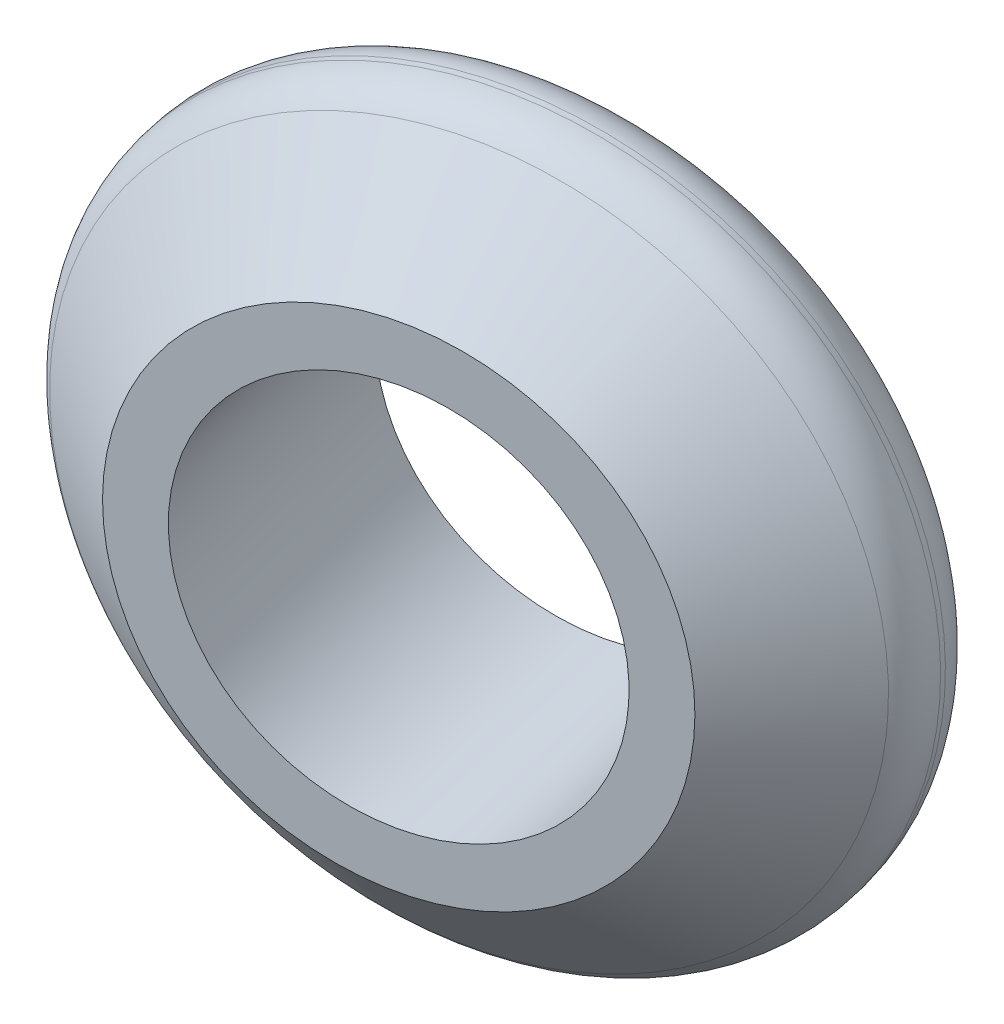
ISO-10303-21;
HEADER;
FILE_DESCRIPTION(('STEP AP214'),'2;1');
FILE_NAME('part.step','',(''),(''),'','','');
FILE_SCHEMA(('AUTOMOTIVE_DESIGN { 1 0 10303 214 1 1 1 1 }'));
ENDSEC;
DATA;
#1=APPLICATION_CONTEXT('core data for automotive mechanical design processes');
#2=APPLICATION_PROTOCOL_DEFINITION('international standard','automotive_design',2000,#1);
#3=PRODUCT_CONTEXT('',#1,'mechanical');
#4=PRODUCT('Part','Part','',(#3));
#5=PRODUCT_RELATED_PRODUCT_CATEGORY('part','',(#4));
#6=PRODUCT_DEFINITION_FORMATION('','',#4);
#7=PRODUCT_DEFINITION_CONTEXT('part definition',#1,'design');
#8=PRODUCT_DEFINITION('design','',#6,#7);
#9=PRODUCT_DEFINITION_SHAPE('','',#8);
#10=(LENGTH_UNIT() NAMED_UNIT(*) SI_UNIT(.MILLI.,.METRE.));
#11=(NAMED_UNIT(*) PLANE_ANGLE_UNIT() SI_UNIT($,.RADIAN.));
#12=(NAMED_UNIT(*) SI_UNIT($,.STERADIAN.) SOLID_ANGLE_UNIT());
#13=UNCERTAINTY_MEASURE_WITH_UNIT(LENGTH_MEASURE(1.E-05),#10,'distance_accuracy_value','');
#14=(GEOMETRIC_REPRESENTATION_CONTEXT(3) GLOBAL_UNCERTAINTY_ASSIGNED_CONTEXT((#13)) GLOBAL_UNIT_ASSIGNED_CONTEXT((#10,
#11,#12)) REPRESENTATION_CONTEXT('',''));
#15=CARTESIAN_POINT('',(0.,0.,0.));
#16=DIRECTION('',(0.,0.,1.));
#17=DIRECTION('',(1.,0.,0.));
#18=AXIS2_PLACEMENT_3D('',#15,#16,#17);
#19=CARTESIAN_POINT('',(-50.,-52.,-19.));
#20=DIRECTION('',(-0.223025134186867,0.,-0.97481269458339));
#21=DIRECTION('',(-0.435945374373544,0.894429302013567,0.0997389305228074));
#22=AXIS2_PLACEMENT_3D('',#19,#20,#21);
#23=CYLINDRICAL_SURFACE('',#22,7.);
#24=CARTESIAN_POINT('',(-48.8848743290657,-52.,-14.125936527083));
#25=DIRECTION('',(-0.223025134186867,0.,-0.97481269458339));
#26=DIRECTION('',(-0.435945374373544,0.894429302013567,0.0997389305228074));
#27=AXIS2_PLACEMENT_3D('',#24,#25,#26);
#28=CIRCLE('',#27,7.);
#29=CARTESIAN_POINT('',(-51.9364919496805,-45.738994885905,-13.4277640134234));
#30=VERTEX_POINT('',#29);
#31=EDGE_CURVE('E59',#30,#30,#28,.T.);
#32=ORIENTED_EDGE('',*,*,#31,.F.);
#33=EDGE_LOOP('',(#32));
#34=FACE_BOUND('',#33,.T.);
#35=CARTESIAN_POINT('',(-51.1151256709343,-52.,-23.8740634729169));
#36=DIRECTION('',(-0.223025134186867,0.,-0.97481269458339));
#37=DIRECTION('',(-0.435945374373544,0.894429302013567,0.0997389305228074));
#38=AXIS2_PLACEMENT_3D('',#35,#36,#37);
#39=CIRCLE('',#38,7.);
#40=CARTESIAN_POINT('',(-54.1667432915491,-45.738994885905,-23.1758909592573));
#41=VERTEX_POINT('',#40);
#42=EDGE_CURVE('E65',#41,#41,#39,.T.);
#43=ORIENTED_EDGE('',*,*,#42,.T.);
#44=EDGE_LOOP('',(#43));
#45=FACE_BOUND('',#44,.T.);
#46=ADVANCED_FACE('F36',(#34,#45),#23,.F.);
#47=CARTESIAN_POINT('',(-50.,-52.,-19.));
#48=DIRECTION('',(-0.223025134186867,0.,-0.97481269458339));
#49=DIRECTION('',(-0.435945374373544,0.894429302013567,0.0997389305228074));
#50=AXIS2_PLACEMENT_3D('',#47,#48,#49);
#51=CYLINDRICAL_SURFACE('',#50,13.4);
#52=CARTESIAN_POINT('',(-49.9742940722374,-52.,-18.8876428667987));
#53=DIRECTION('',(0.223025134186867,0.,0.97481269458339));
#54=DIRECTION('',(0.435945374373544,-0.894429302013567,-0.0997389305228074));
#55=AXIS2_PLACEMENT_3D('',#52,#53,#54);
#56=CIRCLE('',#55,13.4);
#57=CARTESIAN_POINT('',(-44.1326260556319,-63.9853526469818,-20.2241445358043));
#58=VERTEX_POINT('',#57);
#59=EDGE_CURVE('E47',#58,#58,#56,.F.);
#60=ORIENTED_EDGE('',*,*,#59,.T.);
#61=EDGE_LOOP('',(#60));
#62=FACE_BOUND('',#61,.T.);
#63=CARTESIAN_POINT('',(-50.0257059277627,-52.,-19.1123571332013));
#64=DIRECTION('',(0.223025134186867,0.,0.97481269458339));
#65=DIRECTION('',(0.435945374373544,-0.894429302013567,-0.0997389305228074));
#66=AXIS2_PLACEMENT_3D('',#63,#64,#65);
#67=CIRCLE('',#66,13.4);
#68=CARTESIAN_POINT('',(-44.1840379111572,-63.9853526469818,-20.4488588022069));
#69=VERTEX_POINT('',#68);
#70=EDGE_CURVE('E51',#69,#69,#67,.T.);
#71=ORIENTED_EDGE('',*,*,#70,.T.);
#72=EDGE_LOOP('',(#71));
#73=FACE_BOUND('',#72,.T.);
#74=ADVANCED_FACE('F88',(#62,#73),#51,.T.);
#75=CARTESIAN_POINT('',(-48.8848743290657,-52.,-14.1259365270831));
#76=DIRECTION('',(-0.223025134186867,0.,-0.97481269458339));
#77=DIRECTION('',(-0.435945374373544,0.894429302013567,0.0997389305228074));
#78=AXIS2_PLACEMENT_3D('',#75,#76,#77);
#79=CONICAL_SURFACE('',#78,9.,0.832981266674432);
#80=CARTESIAN_POINT('',(-49.6442436039186,-52.,-17.4450369132441));
#81=DIRECTION('',(0.223025134186867,0.,0.97481269458339));
#82=DIRECTION('',(0.435945374373544,-0.894429302013567,-0.0997389305228074));
#83=AXIS2_PLACEMENT_3D('',#80,#81,#82);
#84=CIRCLE('',#83,12.7453455879926);
#85=CARTESIAN_POINT('',(-44.087969150041,-63.39981055819,-18.716244051334));
#86=VERTEX_POINT('',#85);
#87=EDGE_CURVE('E43',#86,#86,#84,.T.);
#88=ORIENTED_EDGE('',*,*,#87,.T.);
#89=EDGE_LOOP('',(#88));
#90=FACE_BOUND('',#89,.T.);
#91=CARTESIAN_POINT('',(-48.8848743290657,-52.,-14.1259365270831));
#92=DIRECTION('',(-0.223025134186867,0.,-0.97481269458339));
#93=DIRECTION('',(-0.435945374373544,0.894429302013567,0.0997389305228074));
#94=AXIS2_PLACEMENT_3D('',#91,#92,#93);
#95=CIRCLE('',#94,9.);
#96=CARTESIAN_POINT('',(-52.8083826984276,-43.9501362818779,-13.2282861523778));
#97=VERTEX_POINT('',#96);
#98=EDGE_CURVE('E56',#97,#97,#95,.T.);
#99=ORIENTED_EDGE('',*,*,#98,.T.);
#100=EDGE_LOOP('',(#99));
#101=FACE_BOUND('',#100,.T.);
#102=ADVANCED_FACE('F84',(#90,#101),#79,.T.);
#103=CARTESIAN_POINT('',(-48.8848743290657,-52.,-14.125936527083));
#104=DIRECTION('',(0.223025134186867,0.,0.97481269458339));
#105=DIRECTION('',(0.435945374373544,-0.894429302013567,-0.0997389305228074));
#106=AXIS2_PLACEMENT_3D('',#103,#104,#105);
#107=PLANE('',#106);
#108=ORIENTED_EDGE('',*,*,#31,.T.);
#109=EDGE_LOOP('',(#108));
#110=FACE_BOUND('',#109,.T.);
#111=ORIENTED_EDGE('',*,*,#98,.F.);
#112=EDGE_LOOP('',(#111));
#113=FACE_BOUND('',#112,.T.);
#114=ADVANCED_FACE('F79',(#110,#113),#107,.T.);
#115=CARTESIAN_POINT('',(-51.1151256709343,-52.,-23.8740634729169));
#116=DIRECTION('',(0.223025134186867,0.,0.97481269458339));
#117=DIRECTION('',(-0.435945374373544,0.894429302013567,0.0997389305228074));
#118=AXIS2_PLACEMENT_3D('',#115,#116,#117);
#119=CONICAL_SURFACE('',#118,9.,0.832981266674432);
#120=CARTESIAN_POINT('',(-50.3557563960814,-52.,-20.5549630867559));
#121=DIRECTION('',(-0.223025134186867,0.,-0.97481269458339));
#122=DIRECTION('',(-0.435945374373544,0.894429302013567,0.0997389305228074));
#123=AXIS2_PLACEMENT_3D('',#120,#121,#122);
#124=CIRCLE('',#123,12.7453455879926);
#125=CARTESIAN_POINT('',(-55.912030849959,-40.6001894418101,-19.283755948666));
#126=VERTEX_POINT('',#125);
#127=EDGE_CURVE('E10',#126,#126,#124,.T.);
#128=ORIENTED_EDGE('',*,*,#127,.T.);
#129=EDGE_LOOP('',(#128));
#130=FACE_BOUND('',#129,.T.);
#131=CARTESIAN_POINT('',(-51.1151256709343,-52.,-23.8740634729169));
#132=DIRECTION('',(-0.223025134186867,0.,-0.97481269458339));
#133=DIRECTION('',(-0.435945374373544,0.894429302013567,0.0997389305228074));
#134=AXIS2_PLACEMENT_3D('',#131,#132,#133);
#135=CIRCLE('',#134,9.);
#136=CARTESIAN_POINT('',(-55.0386340402962,-43.9501362818779,-22.9764130982117));
#137=VERTEX_POINT('',#136);
#138=EDGE_CURVE('E62',#137,#137,#135,.T.);
#139=ORIENTED_EDGE('',*,*,#138,.F.);
#140=EDGE_LOOP('',(#139));
#141=FACE_BOUND('',#140,.T.);
#142=ADVANCED_FACE('F74',(#130,#141),#119,.T.);
#143=CARTESIAN_POINT('',(-51.1151256709343,-52.,-23.8740634729169));
#144=DIRECTION('',(-0.223025134186867,0.,-0.97481269458339));
#145=DIRECTION('',(0.435945374373544,-0.894429302013567,-0.0997389305228074));
#146=AXIS2_PLACEMENT_3D('',#143,#144,#145);
#147=PLANE('',#146);
#148=ORIENTED_EDGE('',*,*,#42,.F.);
#149=EDGE_LOOP('',(#148));
#150=FACE_BOUND('',#149,.T.);
#151=ORIENTED_EDGE('',*,*,#138,.T.);
#152=EDGE_LOOP('',(#151));
#153=FACE_BOUND('',#152,.T.);
#154=ADVANCED_FACE('F70',(#150,#153),#147,.T.);
#155=CARTESIAN_POINT('',(-49.9742940722374,-52.,-18.8876428667987));
#156=DIRECTION('',(0.223025134186867,0.,0.97481269458339));
#157=DIRECTION('',(0.435945374373544,-0.894429302013567,-0.0997389305228074));
#158=AXIS2_PLACEMENT_3D('',#155,#156,#157);
#159=TOROIDAL_SURFACE('',#158,11.4,2.);
#160=ORIENTED_EDGE('',*,*,#87,.F.);
#161=EDGE_LOOP('',(#160));
#162=FACE_BOUND('',#161,.T.);
#163=ORIENTED_EDGE('',*,*,#59,.F.);
#164=EDGE_LOOP('',(#163));
#165=FACE_BOUND('',#164,.T.);
#166=ADVANCED_FACE('F73',(#162,#165),#159,.T.);
#167=CARTESIAN_POINT('',(-50.0257059277627,-52.,-19.1123571332013));
#168=DIRECTION('',(0.223025134186867,0.,0.97481269458339));
#169=DIRECTION('',(0.435945374373544,-0.894429302013567,-0.0997389305228074));
#170=AXIS2_PLACEMENT_3D('',#167,#168,#169);
#171=TOROIDAL_SURFACE('',#170,11.4,2.);
#172=ORIENTED_EDGE('',*,*,#70,.F.);
#173=EDGE_LOOP('',(#172));
#174=FACE_BOUND('',#173,.T.);
#175=ORIENTED_EDGE('',*,*,#127,.F.);
#176=EDGE_LOOP('',(#175));
#177=FACE_BOUND('',#176,.T.);
#178=ADVANCED_FACE('F38',(#174,#177),#171,.T.);
#179=CLOSED_SHELL('',(#46,#74,#102,#114,#142,#154,#166,#178));
#180=MANIFOLD_SOLID_BREP('B2',#179);
#181=ADVANCED_BREP_SHAPE_REPRESENTATION('',(#18,#180),#14);
#182=SHAPE_DEFINITION_REPRESENTATION(#9,#181);
ENDSEC;
END-ISO-10303-21;
